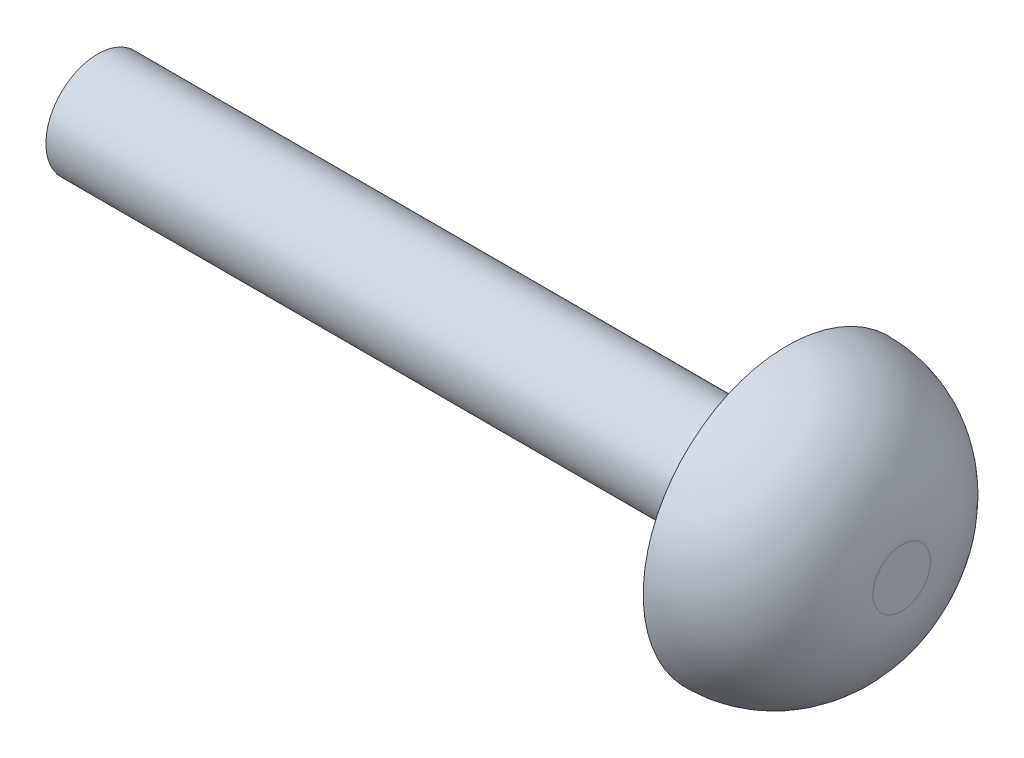
ISO-10303-21;
HEADER;
FILE_DESCRIPTION(('STEP AP214'),'2;1');
FILE_NAME('part.step','',(''),(''),'','','');
FILE_SCHEMA(('AUTOMOTIVE_DESIGN { 1 0 10303 214 1 1 1 1 }'));
ENDSEC;
DATA;
#1=APPLICATION_CONTEXT('core data for automotive mechanical design processes');
#2=APPLICATION_PROTOCOL_DEFINITION('international standard','automotive_design',2000,#1);
#3=PRODUCT_CONTEXT('',#1,'mechanical');
#4=PRODUCT('Part','Part','',(#3));
#5=PRODUCT_RELATED_PRODUCT_CATEGORY('part','',(#4));
#6=PRODUCT_DEFINITION_FORMATION('','',#4);
#7=PRODUCT_DEFINITION_CONTEXT('part definition',#1,'design');
#8=PRODUCT_DEFINITION('design','',#6,#7);
#9=PRODUCT_DEFINITION_SHAPE('','',#8);
#10=(LENGTH_UNIT() NAMED_UNIT(*) SI_UNIT(.MILLI.,.METRE.));
#11=(NAMED_UNIT(*) PLANE_ANGLE_UNIT() SI_UNIT($,.RADIAN.));
#12=(NAMED_UNIT(*) SI_UNIT($,.STERADIAN.) SOLID_ANGLE_UNIT());
#13=UNCERTAINTY_MEASURE_WITH_UNIT(LENGTH_MEASURE(1.E-05),#10,'distance_accuracy_value','');
#14=(GEOMETRIC_REPRESENTATION_CONTEXT(3) GLOBAL_UNCERTAINTY_ASSIGNED_CONTEXT((#13)) GLOBAL_UNIT_ASSIGNED_CONTEXT((#10,
#11,#12)) REPRESENTATION_CONTEXT('',''));
#15=CARTESIAN_POINT('',(0.,0.,0.));
#16=DIRECTION('',(0.,0.,1.));
#17=DIRECTION('',(1.,0.,0.));
#18=AXIS2_PLACEMENT_3D('',#15,#16,#17);
#19=CARTESIAN_POINT('',(12.,0.,0.));
#20=DIRECTION('',(-1.,0.,0.));
#21=DIRECTION('',(0.,0.,1.));
#22=AXIS2_PLACEMENT_3D('',#19,#20,#21);
#23=CYLINDRICAL_SURFACE('',#22,0.9);
#24=CARTESIAN_POINT('',(12.,0.,0.));
#25=DIRECTION('',(1.,0.,0.));
#26=DIRECTION('',(0.,0.,-1.));
#27=AXIS2_PLACEMENT_3D('',#24,#25,#26);
#28=CIRCLE('',#27,0.9);
#29=CARTESIAN_POINT('',(12.,0.,-0.9));
#30=VERTEX_POINT('',#29);
#31=EDGE_CURVE('E21',#30,#30,#28,.T.);
#32=ORIENTED_EDGE('',*,*,#31,.F.);
#33=EDGE_LOOP('',(#32));
#34=FACE_BOUND('',#33,.T.);
#35=CARTESIAN_POINT('',(0.,0.,0.));
#36=DIRECTION('',(1.,0.,0.));
#37=DIRECTION('',(0.,0.,-1.));
#38=AXIS2_PLACEMENT_3D('',#35,#36,#37);
#39=CIRCLE('',#38,0.9);
#40=CARTESIAN_POINT('',(0.,0.,-0.9));
#41=VERTEX_POINT('',#40);
#42=EDGE_CURVE('E25',#41,#41,#39,.T.);
#43=ORIENTED_EDGE('',*,*,#42,.T.);
#44=EDGE_LOOP('',(#43));
#45=FACE_BOUND('',#44,.T.);
#46=ADVANCED_FACE('F14',(#34,#45),#23,.T.);
#47=CARTESIAN_POINT('',(0.,0.,0.));
#48=DIRECTION('',(1.,0.,0.));
#49=DIRECTION('',(0.,0.,-1.));
#50=AXIS2_PLACEMENT_3D('',#47,#48,#49);
#51=PLANE('',#50);
#52=ORIENTED_EDGE('',*,*,#42,.F.);
#53=EDGE_LOOP('',(#52));
#54=FACE_BOUND('',#53,.T.);
#55=ADVANCED_FACE('F47',(#54),#51,.F.);
#56=CARTESIAN_POINT('',(14.,0.,0.));
#57=DIRECTION('',(1.,0.,0.));
#58=DIRECTION('',(0.,0.,-1.));
#59=AXIS2_PLACEMENT_3D('',#56,#57,#58);
#60=PLANE('',#59);
#61=CARTESIAN_POINT('',(14.,0.,0.));
#62=DIRECTION('',(1.,0.,0.));
#63=DIRECTION('',(0.,0.,-1.));
#64=AXIS2_PLACEMENT_3D('',#61,#62,#63);
#65=CIRCLE('',#64,0.5);
#66=CARTESIAN_POINT('',(14.,0.,-0.5));
#67=VERTEX_POINT('',#66);
#68=EDGE_CURVE('E10',#67,#67,#65,.T.);
#69=ORIENTED_EDGE('',*,*,#68,.T.);
#70=EDGE_LOOP('',(#69));
#71=FACE_BOUND('',#70,.T.);
#72=ADVANCED_FACE('F39',(#71),#60,.T.);
#73=CARTESIAN_POINT('',(12.,0.,0.));
#74=DIRECTION('',(1.,0.,0.));
#75=DIRECTION('',(0.,0.,-1.));
#76=AXIS2_PLACEMENT_3D('',#73,#74,#75);
#77=PLANE('',#76);
#78=ORIENTED_EDGE('',*,*,#31,.T.);
#79=EDGE_LOOP('',(#78));
#80=FACE_BOUND('',#79,.T.);
#81=CARTESIAN_POINT('',(12.,0.,0.));
#82=DIRECTION('',(1.,0.,0.));
#83=DIRECTION('',(0.,0.,-1.));
#84=AXIS2_PLACEMENT_3D('',#81,#82,#83);
#85=CIRCLE('',#84,2.5);
#86=CARTESIAN_POINT('',(12.,0.,-2.5));
#87=VERTEX_POINT('',#86);
#88=EDGE_CURVE('E30',#87,#87,#85,.T.);
#89=ORIENTED_EDGE('',*,*,#88,.F.);
#90=EDGE_LOOP('',(#89));
#91=FACE_BOUND('',#90,.T.);
#92=ADVANCED_FACE('F37',(#80,#91),#77,.F.);
#93=CARTESIAN_POINT('',(12.,0.,0.));
#94=DIRECTION('',(1.,0.,0.));
#95=DIRECTION('',(0.,0.,-1.));
#96=AXIS2_PLACEMENT_3D('',#93,#94,#95);
#97=DEGENERATE_TOROIDAL_SURFACE('',#96,0.5,2.,.T.);
#98=ORIENTED_EDGE('',*,*,#88,.T.);
#99=EDGE_LOOP('',(#98));
#100=FACE_BOUND('',#99,.T.);
#101=ORIENTED_EDGE('',*,*,#68,.F.);
#102=EDGE_LOOP('',(#101));
#103=FACE_BOUND('',#102,.T.);
#104=ADVANCED_FACE('F16',(#100,#103),#97,.T.);
#105=CLOSED_SHELL('',(#46,#55,#72,#92,#104));
#106=MANIFOLD_SOLID_BREP('B1',#105);
#107=ADVANCED_BREP_SHAPE_REPRESENTATION('',(#18,#106),#14);
#108=SHAPE_DEFINITION_REPRESENTATION(#9,#107);
ENDSEC;
END-ISO-10303-21;
